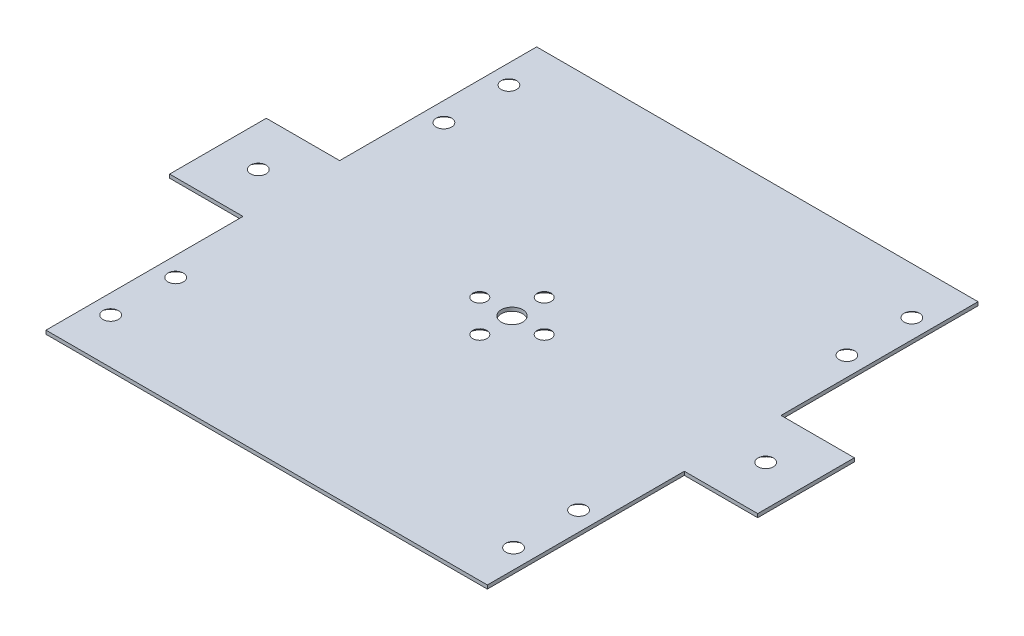
ISO-10303-21;
HEADER;
FILE_DESCRIPTION(('STEP AP214'),'2;1');
FILE_NAME('part.step','',(''),(''),'','','');
FILE_SCHEMA(('AUTOMOTIVE_DESIGN { 1 0 10303 214 1 1 1 1 }'));
ENDSEC;
DATA;
#1=APPLICATION_CONTEXT('core data for automotive mechanical design processes');
#2=APPLICATION_PROTOCOL_DEFINITION('international standard','automotive_design',2000,#1);
#3=PRODUCT_CONTEXT('',#1,'mechanical');
#4=PRODUCT('Part','Part','',(#3));
#5=PRODUCT_RELATED_PRODUCT_CATEGORY('part','',(#4));
#6=PRODUCT_DEFINITION_FORMATION('','',#4);
#7=PRODUCT_DEFINITION_CONTEXT('part definition',#1,'design');
#8=PRODUCT_DEFINITION('design','',#6,#7);
#9=PRODUCT_DEFINITION_SHAPE('','',#8);
#10=(LENGTH_UNIT() NAMED_UNIT(*) SI_UNIT(.MILLI.,.METRE.));
#11=(NAMED_UNIT(*) PLANE_ANGLE_UNIT() SI_UNIT($,.RADIAN.));
#12=(NAMED_UNIT(*) SI_UNIT($,.STERADIAN.) SOLID_ANGLE_UNIT());
#13=UNCERTAINTY_MEASURE_WITH_UNIT(LENGTH_MEASURE(1.E-05),#10,'distance_accuracy_value','');
#14=(GEOMETRIC_REPRESENTATION_CONTEXT(3) GLOBAL_UNCERTAINTY_ASSIGNED_CONTEXT((#13)) GLOBAL_UNIT_ASSIGNED_CONTEXT((#10,
#11,#12)) REPRESENTATION_CONTEXT('',''));
#15=CARTESIAN_POINT('',(0.,0.,0.));
#16=DIRECTION('',(0.,0.,1.));
#17=DIRECTION('',(1.,0.,0.));
#18=AXIS2_PLACEMENT_3D('',#15,#16,#17);
#19=CARTESIAN_POINT('',(0.,1.0668,0.));
#20=DIRECTION('',(0.,-1.,0.));
#21=DIRECTION('',(0.,0.,-1.));
#22=AXIS2_PLACEMENT_3D('',#19,#20,#21);
#23=PLANE('',#22);
#24=CARTESIAN_POINT('',(9.50000000000003,1.0668,0.));
#25=DIRECTION('',(0.,-1.,0.));
#26=DIRECTION('',(0.,0.,-1.));
#27=AXIS2_PLACEMENT_3D('',#24,#25,#26);
#28=CIRCLE('',#27,2.0832);
#29=CARTESIAN_POINT('',(9.50000000000003,1.0668,-2.0832));
#30=VERTEX_POINT('',#29);
#31=EDGE_CURVE('E334',#30,#30,#28,.T.);
#32=ORIENTED_EDGE('',*,*,#31,.T.);
#33=EDGE_LOOP('',(#32));
#34=FACE_BOUND('',#33,.T.);
#35=CARTESIAN_POINT('',(0.,1.0668,-9.5));
#36=DIRECTION('',(0.,-1.,0.));
#37=DIRECTION('',(0.,0.,-1.));
#38=AXIS2_PLACEMENT_3D('',#35,#36,#37);
#39=CIRCLE('',#38,2.0832);
#40=CARTESIAN_POINT('',(0.,1.0668,-11.5832));
#41=VERTEX_POINT('',#40);
#42=EDGE_CURVE('E347',#41,#41,#39,.T.);
#43=ORIENTED_EDGE('',*,*,#42,.T.);
#44=EDGE_LOOP('',(#43));
#45=FACE_BOUND('',#44,.T.);
#46=CARTESIAN_POINT('',(0.,1.0668,0.));
#47=DIRECTION('',(0.,-1.,0.));
#48=DIRECTION('',(0.,0.,-1.));
#49=AXIS2_PLACEMENT_3D('',#46,#47,#48);
#50=CIRCLE('',#49,3.175);
#51=CARTESIAN_POINT('',(0.,1.0668,-3.175));
#52=VERTEX_POINT('',#51);
#53=EDGE_CURVE('E357',#52,#52,#50,.T.);
#54=ORIENTED_EDGE('',*,*,#53,.T.);
#55=EDGE_LOOP('',(#54));
#56=FACE_BOUND('',#55,.T.);
#57=CARTESIAN_POINT('',(-59.420125,1.0668,58.959758400001));
#58=DIRECTION('',(0.,-1.,0.));
#59=DIRECTION('',(0.,0.,-1.));
#60=AXIS2_PLACEMENT_3D('',#57,#58,#59);
#61=CIRCLE('',#60,2.27193726742048);
#62=CARTESIAN_POINT('',(-59.420125,1.0668,56.6878211325805));
#63=VERTEX_POINT('',#62);
#64=EDGE_CURVE('E365',#63,#63,#61,.T.);
#65=ORIENTED_EDGE('',*,*,#64,.T.);
#66=EDGE_LOOP('',(#65));
#67=FACE_BOUND('',#66,.T.);
#68=CARTESIAN_POINT('',(59.420125,1.0668,-58.5152499999991));
#69=DIRECTION('',(0.,-1.,0.));
#70=DIRECTION('',(0.,0.,-1.));
#71=AXIS2_PLACEMENT_3D('',#68,#69,#70);
#72=CIRCLE('',#71,2.27193726742048);
#73=CARTESIAN_POINT('',(59.420125,1.0668,-60.7871872674196));
#74=VERTEX_POINT('',#73);
#75=EDGE_CURVE('E377',#74,#74,#72,.T.);
#76=ORIENTED_EDGE('',*,*,#75,.T.);
#77=EDGE_LOOP('',(#76));
#78=FACE_BOUND('',#77,.T.);
#79=CARTESIAN_POINT('',(59.420125,1.0668,39.7827500000009));
#80=DIRECTION('',(0.,-1.,0.));
#81=DIRECTION('',(0.,0.,-1.));
#82=AXIS2_PLACEMENT_3D('',#79,#80,#81);
#83=CIRCLE('',#82,2.27193726742048);
#84=CARTESIAN_POINT('',(59.420125,1.0668,37.5108127325805));
#85=VERTEX_POINT('',#84);
#86=EDGE_CURVE('E389',#85,#85,#83,.T.);
#87=ORIENTED_EDGE('',*,*,#86,.T.);
#88=EDGE_LOOP('',(#87));
#89=FACE_BOUND('',#88,.T.);
#90=CARTESIAN_POINT('',(59.420125,1.0668,-39.3382499999991));
#91=DIRECTION('',(0.,-1.,0.));
#92=DIRECTION('',(0.,0.,-1.));
#93=AXIS2_PLACEMENT_3D('',#90,#91,#92);
#94=CIRCLE('',#93,2.27193726742048);
#95=CARTESIAN_POINT('',(59.420125,1.0668,-41.6101872674196));
#96=VERTEX_POINT('',#95);
#97=EDGE_CURVE('E401',#96,#96,#94,.T.);
#98=ORIENTED_EDGE('',*,*,#97,.T.);
#99=EDGE_LOOP('',(#98));
#100=FACE_BOUND('',#99,.T.);
#101=CARTESIAN_POINT('',(-74.818875,1.0668,0.));
#102=DIRECTION('',(0.,-1.,0.));
#103=DIRECTION('',(0.,0.,-1.));
#104=AXIS2_PLACEMENT_3D('',#101,#102,#103);
#105=CIRCLE('',#104,2.27193726742048);
#106=CARTESIAN_POINT('',(-74.818875,1.0668,-2.27193726742048));
#107=VERTEX_POINT('',#106);
#108=EDGE_CURVE('E413',#107,#107,#105,.T.);
#109=ORIENTED_EDGE('',*,*,#108,.T.);
#110=EDGE_LOOP('',(#109));
#111=FACE_BOUND('',#110,.T.);
#112=DIRECTION('',(0.,0.,1.));
#113=VECTOR('',#112,1.);
#114=CARTESIAN_POINT('',(-65.0875,1.0668,72.35825));
#115=LINE('',#114,#113);
#116=CARTESIAN_POINT('',(-65.0875,1.0668,14.25575));
#117=VERTEX_POINT('',#116);
#118=CARTESIAN_POINT('',(-65.0875,1.0668,72.35825));
#119=VERTEX_POINT('',#118);
#120=EDGE_CURVE('E181',#117,#119,#115,.T.);
#121=ORIENTED_EDGE('',*,*,#120,.T.);
#122=DIRECTION('',(1.,0.,0.));
#123=VECTOR('',#122,1.);
#124=CARTESIAN_POINT('',(-65.0875,1.0668,72.35825));
#125=LINE('',#124,#123);
#126=CARTESIAN_POINT('',(65.0875,1.0668,72.35825));
#127=VERTEX_POINT('',#126);
#128=EDGE_CURVE('E109',#119,#127,#125,.T.);
#129=ORIENTED_EDGE('',*,*,#128,.T.);
#130=DIRECTION('',(0.,0.,-1.));
#131=VECTOR('',#130,1.);
#132=CARTESIAN_POINT('',(65.0875,1.0668,72.35825));
#133=LINE('',#132,#131);
#134=CARTESIAN_POINT('',(65.0875,1.0668,14.25575));
#135=VERTEX_POINT('',#134);
#136=EDGE_CURVE('E208',#127,#135,#133,.T.);
#137=ORIENTED_EDGE('',*,*,#136,.T.);
#138=DIRECTION('',(1.,0.,0.));
#139=VECTOR('',#138,1.);
#140=CARTESIAN_POINT('',(86.725125,1.0668,14.25575));
#141=LINE('',#140,#139);
#142=CARTESIAN_POINT('',(86.725125,1.0668,14.25575));
#143=VERTEX_POINT('',#142);
#144=EDGE_CURVE('E226',#135,#143,#141,.T.);
#145=ORIENTED_EDGE('',*,*,#144,.T.);
#146=DIRECTION('',(0.,0.,-1.));
#147=VECTOR('',#146,1.);
#148=CARTESIAN_POINT('',(86.725125,1.0668,-14.25575));
#149=LINE('',#148,#147);
#150=CARTESIAN_POINT('',(86.725125,1.0668,-14.25575));
#151=VERTEX_POINT('',#150);
#152=EDGE_CURVE('E223',#143,#151,#149,.T.);
#153=ORIENTED_EDGE('',*,*,#152,.T.);
#154=DIRECTION('',(-1.,0.,0.));
#155=VECTOR('',#154,1.);
#156=CARTESIAN_POINT('',(86.725125,1.0668,-14.25575));
#157=LINE('',#156,#155);
#158=CARTESIAN_POINT('',(65.0875,1.0668,-14.25575));
#159=VERTEX_POINT('',#158);
#160=EDGE_CURVE('E225',#151,#159,#157,.T.);
#161=ORIENTED_EDGE('',*,*,#160,.T.);
#162=DIRECTION('',(0.,0.,-1.));
#163=VECTOR('',#162,1.);
#164=CARTESIAN_POINT('',(65.0875,1.0668,-72.35825));
#165=LINE('',#164,#163);
#166=CARTESIAN_POINT('',(65.0875,1.0668,-72.35825));
#167=VERTEX_POINT('',#166);
#168=EDGE_CURVE('E228',#159,#167,#165,.T.);
#169=ORIENTED_EDGE('',*,*,#168,.T.);
#170=DIRECTION('',(-1.,0.,0.));
#171=VECTOR('',#170,1.);
#172=CARTESIAN_POINT('',(-65.0875,1.0668,-72.35825));
#173=LINE('',#172,#171);
#174=CARTESIAN_POINT('',(-65.0875,1.0668,-72.35825));
#175=VERTEX_POINT('',#174);
#176=EDGE_CURVE('E234',#167,#175,#173,.T.);
#177=ORIENTED_EDGE('',*,*,#176,.T.);
#178=DIRECTION('',(0.,0.,1.));
#179=VECTOR('',#178,1.);
#180=CARTESIAN_POINT('',(-65.0875,1.0668,-72.35825));
#181=LINE('',#180,#179);
#182=CARTESIAN_POINT('',(-65.0875,1.0668,-14.25575));
#183=VERTEX_POINT('',#182);
#184=EDGE_CURVE('E140',#175,#183,#181,.T.);
#185=ORIENTED_EDGE('',*,*,#184,.T.);
#186=DIRECTION('',(-1.,0.,0.));
#187=VECTOR('',#186,1.);
#188=CARTESIAN_POINT('',(-86.725125,1.0668,-14.25575));
#189=LINE('',#188,#187);
#190=CARTESIAN_POINT('',(-86.725125,1.0668,-14.25575));
#191=VERTEX_POINT('',#190);
#192=EDGE_CURVE('E134',#183,#191,#189,.T.);
#193=ORIENTED_EDGE('',*,*,#192,.T.);
#194=DIRECTION('',(0.,0.,1.));
#195=VECTOR('',#194,1.);
#196=CARTESIAN_POINT('',(-86.725125,1.0668,-14.25575));
#197=LINE('',#196,#195);
#198=CARTESIAN_POINT('',(-86.725125,1.0668,14.25575));
#199=VERTEX_POINT('',#198);
#200=EDGE_CURVE('E138',#191,#199,#197,.T.);
#201=ORIENTED_EDGE('',*,*,#200,.T.);
#202=DIRECTION('',(1.,0.,0.));
#203=VECTOR('',#202,1.);
#204=CARTESIAN_POINT('',(-86.725125,1.0668,14.25575));
#205=LINE('',#204,#203);
#206=EDGE_CURVE('E54',#199,#117,#205,.T.);
#207=ORIENTED_EDGE('',*,*,#206,.T.);
#208=EDGE_LOOP('',(#121,#129,#137,#145,#153,#161,#169,#177,#185,#193,#201,#207));
#209=FACE_BOUND('',#208,.T.);
#210=CARTESIAN_POINT('',(74.818875,1.0668,0.));
#211=DIRECTION('',(0.,-1.,0.));
#212=DIRECTION('',(0.,0.,-1.));
#213=AXIS2_PLACEMENT_3D('',#210,#211,#212);
#214=CIRCLE('',#213,2.27193726742048);
#215=CARTESIAN_POINT('',(74.818875,1.0668,-2.27193726742048));
#216=VERTEX_POINT('',#215);
#217=EDGE_CURVE('E162',#216,#216,#214,.T.);
#218=ORIENTED_EDGE('',*,*,#217,.T.);
#219=EDGE_LOOP('',(#218));
#220=FACE_BOUND('',#219,.T.);
#221=CARTESIAN_POINT('',(-59.420125,1.0668,39.7827584000009));
#222=DIRECTION('',(0.,-1.,0.));
#223=DIRECTION('',(0.,0.,-1.));
#224=AXIS2_PLACEMENT_3D('',#221,#222,#223);
#225=CIRCLE('',#224,2.27193726742048);
#226=CARTESIAN_POINT('',(-59.420125,1.0668,37.5108211325805));
#227=VERTEX_POINT('',#226);
#228=EDGE_CURVE('E407',#227,#227,#225,.T.);
#229=ORIENTED_EDGE('',*,*,#228,.T.);
#230=EDGE_LOOP('',(#229));
#231=FACE_BOUND('',#230,.T.);
#232=CARTESIAN_POINT('',(-59.420125,1.0668,-39.3382415999991));
#233=DIRECTION('',(0.,-1.,0.));
#234=DIRECTION('',(0.,0.,-1.));
#235=AXIS2_PLACEMENT_3D('',#232,#233,#234);
#236=CIRCLE('',#235,2.27193726742048);
#237=CARTESIAN_POINT('',(-59.420125,1.0668,-41.6101788674196));
#238=VERTEX_POINT('',#237);
#239=EDGE_CURVE('E395',#238,#238,#236,.T.);
#240=ORIENTED_EDGE('',*,*,#239,.T.);
#241=EDGE_LOOP('',(#240));
#242=FACE_BOUND('',#241,.T.);
#243=CARTESIAN_POINT('',(59.420125,1.0668,58.959750000001));
#244=DIRECTION('',(0.,-1.,0.));
#245=DIRECTION('',(0.,0.,-1.));
#246=AXIS2_PLACEMENT_3D('',#243,#244,#245);
#247=CIRCLE('',#246,2.27193726742048);
#248=CARTESIAN_POINT('',(59.420125,1.0668,56.6878127325805));
#249=VERTEX_POINT('',#248);
#250=EDGE_CURVE('E383',#249,#249,#247,.T.);
#251=ORIENTED_EDGE('',*,*,#250,.T.);
#252=EDGE_LOOP('',(#251));
#253=FACE_BOUND('',#252,.T.);
#254=CARTESIAN_POINT('',(-59.420125,1.0668,-58.5152415999991));
#255=DIRECTION('',(0.,-1.,0.));
#256=DIRECTION('',(0.,0.,-1.));
#257=AXIS2_PLACEMENT_3D('',#254,#255,#256);
#258=CIRCLE('',#257,2.27193726742048);
#259=CARTESIAN_POINT('',(-59.420125,1.0668,-60.7871788674196));
#260=VERTEX_POINT('',#259);
#261=EDGE_CURVE('E371',#260,#260,#258,.T.);
#262=ORIENTED_EDGE('',*,*,#261,.T.);
#263=EDGE_LOOP('',(#262));
#264=FACE_BOUND('',#263,.T.);
#265=CARTESIAN_POINT('',(0.,1.0668,9.5));
#266=DIRECTION('',(0.,-1.,0.));
#267=DIRECTION('',(0.,0.,-1.));
#268=AXIS2_PLACEMENT_3D('',#265,#266,#267);
#269=CIRCLE('',#268,2.0832);
#270=CARTESIAN_POINT('',(0.,1.0668,7.4168));
#271=VERTEX_POINT('',#270);
#272=EDGE_CURVE('E353',#271,#271,#269,.T.);
#273=ORIENTED_EDGE('',*,*,#272,.T.);
#274=EDGE_LOOP('',(#273));
#275=FACE_BOUND('',#274,.T.);
#276=CARTESIAN_POINT('',(-9.50000000000003,1.0668,0.));
#277=DIRECTION('',(0.,-1.,0.));
#278=DIRECTION('',(0.,0.,-1.));
#279=AXIS2_PLACEMENT_3D('',#276,#277,#278);
#280=CIRCLE('',#279,2.0832);
#281=CARTESIAN_POINT('',(-9.50000000000003,1.0668,-2.0832));
#282=VERTEX_POINT('',#281);
#283=EDGE_CURVE('E338',#282,#282,#280,.T.);
#284=ORIENTED_EDGE('',*,*,#283,.T.);
#285=EDGE_LOOP('',(#284));
#286=FACE_BOUND('',#285,.T.);
#287=ADVANCED_FACE('F37',(#34,#45,#56,#67,#78,#89,#100,#111,#209,#220,#231,#242,#253,#264,#275,
#286),#23,.F.);
#288=CARTESIAN_POINT('',(-65.0875,1.0668,72.35825));
#289=DIRECTION('',(1.,0.,0.));
#290=DIRECTION('',(0.,0.,-1.));
#291=AXIS2_PLACEMENT_3D('',#288,#289,#290);
#292=PLANE('',#291);
#293=DIRECTION('',(0.,0.,1.));
#294=VECTOR('',#293,1.);
#295=CARTESIAN_POINT('',(-65.0875,0.,72.35825));
#296=LINE('',#295,#294);
#297=CARTESIAN_POINT('',(-65.0875,0.,14.25575));
#298=VERTEX_POINT('',#297);
#299=CARTESIAN_POINT('',(-65.0875,0.,72.35825));
#300=VERTEX_POINT('',#299);
#301=EDGE_CURVE('E158',#298,#300,#296,.T.);
#302=ORIENTED_EDGE('',*,*,#301,.T.);
#303=DIRECTION('',(0.,-1.,0.));
#304=VECTOR('',#303,1.);
#305=CARTESIAN_POINT('',(-65.0875,1.0668,72.35825));
#306=LINE('',#305,#304);
#307=EDGE_CURVE('E11',#119,#300,#306,.T.);
#308=ORIENTED_EDGE('',*,*,#307,.F.);
#309=ORIENTED_EDGE('',*,*,#120,.F.);
#310=DIRECTION('',(0.,-1.,0.));
#311=VECTOR('',#310,1.);
#312=CARTESIAN_POINT('',(-65.0875,1.0668,14.25575));
#313=LINE('',#312,#311);
#314=EDGE_CURVE('E154',#117,#298,#313,.T.);
#315=ORIENTED_EDGE('',*,*,#314,.T.);
#316=EDGE_LOOP('',(#302,#308,#309,#315));
#317=FACE_BOUND('',#316,.T.);
#318=ADVANCED_FACE('F39',(#317),#292,.F.);
#319=CARTESIAN_POINT('',(-65.0875,1.0668,72.35825));
#320=DIRECTION('',(0.,0.,-1.));
#321=DIRECTION('',(-1.,0.,0.));
#322=AXIS2_PLACEMENT_3D('',#319,#320,#321);
#323=PLANE('',#322);
#324=DIRECTION('',(1.,0.,0.));
#325=VECTOR('',#324,1.);
#326=CARTESIAN_POINT('',(-65.0875,0.,72.35825));
#327=LINE('',#326,#325);
#328=CARTESIAN_POINT('',(65.0875,0.,72.35825));
#329=VERTEX_POINT('',#328);
#330=EDGE_CURVE('E161',#300,#329,#327,.T.);
#331=ORIENTED_EDGE('',*,*,#330,.T.);
#332=DIRECTION('',(0.,-1.,0.));
#333=VECTOR('',#332,1.);
#334=CARTESIAN_POINT('',(65.0875,1.0668,72.35825));
#335=LINE('',#334,#333);
#336=EDGE_CURVE('E46',#127,#329,#335,.T.);
#337=ORIENTED_EDGE('',*,*,#336,.F.);
#338=ORIENTED_EDGE('',*,*,#128,.F.);
#339=ORIENTED_EDGE('',*,*,#307,.T.);
#340=EDGE_LOOP('',(#331,#337,#338,#339));
#341=FACE_BOUND('',#340,.T.);
#342=ADVANCED_FACE('F265',(#341),#323,.F.);
#343=CARTESIAN_POINT('',(65.0875,1.0668,72.35825));
#344=DIRECTION('',(-1.,0.,0.));
#345=DIRECTION('',(0.,0.,1.));
#346=AXIS2_PLACEMENT_3D('',#343,#344,#345);
#347=PLANE('',#346);
#348=DIRECTION('',(0.,0.,-1.));
#349=VECTOR('',#348,1.);
#350=CARTESIAN_POINT('',(65.0875,0.,72.35825));
#351=LINE('',#350,#349);
#352=CARTESIAN_POINT('',(65.0875,0.,14.25575));
#353=VERTEX_POINT('',#352);
#354=EDGE_CURVE('E164',#329,#353,#351,.T.);
#355=ORIENTED_EDGE('',*,*,#354,.T.);
#356=DIRECTION('',(0.,-1.,0.));
#357=VECTOR('',#356,1.);
#358=CARTESIAN_POINT('',(65.0875,1.0668,14.25575));
#359=LINE('',#358,#357);
#360=EDGE_CURVE('E200',#135,#353,#359,.T.);
#361=ORIENTED_EDGE('',*,*,#360,.F.);
#362=ORIENTED_EDGE('',*,*,#136,.F.);
#363=ORIENTED_EDGE('',*,*,#336,.T.);
#364=EDGE_LOOP('',(#355,#361,#362,#363));
#365=FACE_BOUND('',#364,.T.);
#366=ADVANCED_FACE('F206',(#365),#347,.F.);
#367=CARTESIAN_POINT('',(86.725125,1.0668,14.25575));
#368=DIRECTION('',(0.,0.,-1.));
#369=DIRECTION('',(-1.,0.,0.));
#370=AXIS2_PLACEMENT_3D('',#367,#368,#369);
#371=PLANE('',#370);
#372=DIRECTION('',(1.,0.,0.));
#373=VECTOR('',#372,1.);
#374=CARTESIAN_POINT('',(86.725125,0.,14.25575));
#375=LINE('',#374,#373);
#376=CARTESIAN_POINT('',(86.725125,0.,14.25575));
#377=VERTEX_POINT('',#376);
#378=EDGE_CURVE('E166',#353,#377,#375,.T.);
#379=ORIENTED_EDGE('',*,*,#378,.T.);
#380=DIRECTION('',(0.,-1.,0.));
#381=VECTOR('',#380,1.);
#382=CARTESIAN_POINT('',(86.725125,1.0668,14.25575));
#383=LINE('',#382,#381);
#384=EDGE_CURVE('E197',#143,#377,#383,.T.);
#385=ORIENTED_EDGE('',*,*,#384,.F.);
#386=ORIENTED_EDGE('',*,*,#144,.F.);
#387=ORIENTED_EDGE('',*,*,#360,.T.);
#388=EDGE_LOOP('',(#379,#385,#386,#387));
#389=FACE_BOUND('',#388,.T.);
#390=ADVANCED_FACE('F217',(#389),#371,.F.);
#391=CARTESIAN_POINT('',(86.725125,1.0668,-14.25575));
#392=DIRECTION('',(-1.,0.,0.));
#393=DIRECTION('',(0.,0.,1.));
#394=AXIS2_PLACEMENT_3D('',#391,#392,#393);
#395=PLANE('',#394);
#396=DIRECTION('',(0.,0.,-1.));
#397=VECTOR('',#396,1.);
#398=CARTESIAN_POINT('',(86.725125,0.,-14.25575));
#399=LINE('',#398,#397);
#400=CARTESIAN_POINT('',(86.725125,0.,-14.25575));
#401=VERTEX_POINT('',#400);
#402=EDGE_CURVE('E168',#377,#401,#399,.T.);
#403=ORIENTED_EDGE('',*,*,#402,.T.);
#404=DIRECTION('',(0.,-1.,0.));
#405=VECTOR('',#404,1.);
#406=CARTESIAN_POINT('',(86.725125,1.0668,-14.25575));
#407=LINE('',#406,#405);
#408=EDGE_CURVE('E194',#151,#401,#407,.T.);
#409=ORIENTED_EDGE('',*,*,#408,.F.);
#410=ORIENTED_EDGE('',*,*,#152,.F.);
#411=ORIENTED_EDGE('',*,*,#384,.T.);
#412=EDGE_LOOP('',(#403,#409,#410,#411));
#413=FACE_BOUND('',#412,.T.);
#414=ADVANCED_FACE('F221',(#413),#395,.F.);
#415=CARTESIAN_POINT('',(86.725125,1.0668,-14.25575));
#416=DIRECTION('',(0.,0.,1.));
#417=DIRECTION('',(1.,0.,0.));
#418=AXIS2_PLACEMENT_3D('',#415,#416,#417);
#419=PLANE('',#418);
#420=DIRECTION('',(-1.,0.,0.));
#421=VECTOR('',#420,1.);
#422=CARTESIAN_POINT('',(86.725125,0.,-14.25575));
#423=LINE('',#422,#421);
#424=CARTESIAN_POINT('',(65.0875,0.,-14.25575));
#425=VERTEX_POINT('',#424);
#426=EDGE_CURVE('E170',#401,#425,#423,.T.);
#427=ORIENTED_EDGE('',*,*,#426,.T.);
#428=DIRECTION('',(0.,-1.,0.));
#429=VECTOR('',#428,1.);
#430=CARTESIAN_POINT('',(65.0875,1.0668,-14.25575));
#431=LINE('',#430,#429);
#432=EDGE_CURVE('E191',#159,#425,#431,.T.);
#433=ORIENTED_EDGE('',*,*,#432,.F.);
#434=ORIENTED_EDGE('',*,*,#160,.F.);
#435=ORIENTED_EDGE('',*,*,#408,.T.);
#436=EDGE_LOOP('',(#427,#433,#434,#435));
#437=FACE_BOUND('',#436,.T.);
#438=ADVANCED_FACE('F625',(#437),#419,.F.);
#439=CARTESIAN_POINT('',(65.0875,1.0668,-72.35825));
#440=DIRECTION('',(-1.,0.,0.));
#441=DIRECTION('',(0.,0.,1.));
#442=AXIS2_PLACEMENT_3D('',#439,#440,#441);
#443=PLANE('',#442);
#444=DIRECTION('',(0.,0.,-1.));
#445=VECTOR('',#444,1.);
#446=CARTESIAN_POINT('',(65.0875,0.,-72.35825));
#447=LINE('',#446,#445);
#448=CARTESIAN_POINT('',(65.0875,0.,-72.35825));
#449=VERTEX_POINT('',#448);
#450=EDGE_CURVE('E172',#425,#449,#447,.T.);
#451=ORIENTED_EDGE('',*,*,#450,.T.);
#452=DIRECTION('',(0.,-1.,0.));
#453=VECTOR('',#452,1.);
#454=CARTESIAN_POINT('',(65.0875,1.0668,-72.35825));
#455=LINE('',#454,#453);
#456=EDGE_CURVE('E188',#167,#449,#455,.T.);
#457=ORIENTED_EDGE('',*,*,#456,.F.);
#458=ORIENTED_EDGE('',*,*,#168,.F.);
#459=ORIENTED_EDGE('',*,*,#432,.T.);
#460=EDGE_LOOP('',(#451,#457,#458,#459));
#461=FACE_BOUND('',#460,.T.);
#462=ADVANCED_FACE('F617',(#461),#443,.F.);
#463=CARTESIAN_POINT('',(-65.0875,1.0668,-72.35825));
#464=DIRECTION('',(0.,0.,1.));
#465=DIRECTION('',(1.,0.,0.));
#466=AXIS2_PLACEMENT_3D('',#463,#464,#465);
#467=PLANE('',#466);
#468=DIRECTION('',(-1.,0.,0.));
#469=VECTOR('',#468,1.);
#470=CARTESIAN_POINT('',(-65.0875,0.,-72.35825));
#471=LINE('',#470,#469);
#472=CARTESIAN_POINT('',(-65.0875,0.,-72.35825));
#473=VERTEX_POINT('',#472);
#474=EDGE_CURVE('E174',#449,#473,#471,.T.);
#475=ORIENTED_EDGE('',*,*,#474,.T.);
#476=DIRECTION('',(0.,-1.,0.));
#477=VECTOR('',#476,1.);
#478=CARTESIAN_POINT('',(-65.0875,1.0668,-72.35825));
#479=LINE('',#478,#477);
#480=EDGE_CURVE('E185',#175,#473,#479,.T.);
#481=ORIENTED_EDGE('',*,*,#480,.F.);
#482=ORIENTED_EDGE('',*,*,#176,.F.);
#483=ORIENTED_EDGE('',*,*,#456,.T.);
#484=EDGE_LOOP('',(#475,#481,#482,#483));
#485=FACE_BOUND('',#484,.T.);
#486=ADVANCED_FACE('F240',(#485),#467,.F.);
#487=CARTESIAN_POINT('',(-65.0875,1.0668,-72.35825));
#488=DIRECTION('',(1.,0.,0.));
#489=DIRECTION('',(0.,0.,-1.));
#490=AXIS2_PLACEMENT_3D('',#487,#488,#489);
#491=PLANE('',#490);
#492=DIRECTION('',(0.,0.,1.));
#493=VECTOR('',#492,1.);
#494=CARTESIAN_POINT('',(-65.0875,0.,-72.35825));
#495=LINE('',#494,#493);
#496=CARTESIAN_POINT('',(-65.0875,0.,-14.25575));
#497=VERTEX_POINT('',#496);
#498=EDGE_CURVE('E176',#473,#497,#495,.T.);
#499=ORIENTED_EDGE('',*,*,#498,.T.);
#500=DIRECTION('',(0.,-1.,0.));
#501=VECTOR('',#500,1.);
#502=CARTESIAN_POINT('',(-65.0875,1.0668,-14.25575));
#503=LINE('',#502,#501);
#504=EDGE_CURVE('E149',#183,#497,#503,.T.);
#505=ORIENTED_EDGE('',*,*,#504,.F.);
#506=ORIENTED_EDGE('',*,*,#184,.F.);
#507=ORIENTED_EDGE('',*,*,#480,.T.);
#508=EDGE_LOOP('',(#499,#505,#506,#507));
#509=FACE_BOUND('',#508,.T.);
#510=ADVANCED_FACE('F244',(#509),#491,.F.);
#511=CARTESIAN_POINT('',(-86.725125,1.0668,-14.25575));
#512=DIRECTION('',(0.,0.,1.));
#513=DIRECTION('',(1.,0.,0.));
#514=AXIS2_PLACEMENT_3D('',#511,#512,#513);
#515=PLANE('',#514);
#516=DIRECTION('',(-1.,0.,0.));
#517=VECTOR('',#516,1.);
#518=CARTESIAN_POINT('',(-86.725125,0.,-14.25575));
#519=LINE('',#518,#517);
#520=CARTESIAN_POINT('',(-86.725125,0.,-14.25575));
#521=VERTEX_POINT('',#520);
#522=EDGE_CURVE('E148',#497,#521,#519,.T.);
#523=ORIENTED_EDGE('',*,*,#522,.T.);
#524=DIRECTION('',(0.,-1.,0.));
#525=VECTOR('',#524,1.);
#526=CARTESIAN_POINT('',(-86.725125,1.0668,-14.25575));
#527=LINE('',#526,#525);
#528=EDGE_CURVE('E145',#191,#521,#527,.T.);
#529=ORIENTED_EDGE('',*,*,#528,.F.);
#530=ORIENTED_EDGE('',*,*,#192,.F.);
#531=ORIENTED_EDGE('',*,*,#504,.T.);
#532=EDGE_LOOP('',(#523,#529,#530,#531));
#533=FACE_BOUND('',#532,.T.);
#534=ADVANCED_FACE('F146',(#533),#515,.F.);
#535=CARTESIAN_POINT('',(-86.725125,1.0668,-14.25575));
#536=DIRECTION('',(1.,0.,0.));
#537=DIRECTION('',(0.,0.,-1.));
#538=AXIS2_PLACEMENT_3D('',#535,#536,#537);
#539=PLANE('',#538);
#540=DIRECTION('',(0.,0.,1.));
#541=VECTOR('',#540,1.);
#542=CARTESIAN_POINT('',(-86.725125,0.,-14.25575));
#543=LINE('',#542,#541);
#544=CARTESIAN_POINT('',(-86.725125,0.,14.25575));
#545=VERTEX_POINT('',#544);
#546=EDGE_CURVE('E95',#521,#545,#543,.T.);
#547=ORIENTED_EDGE('',*,*,#546,.T.);
#548=DIRECTION('',(0.,-1.,0.));
#549=VECTOR('',#548,1.);
#550=CARTESIAN_POINT('',(-86.725125,1.0668,14.25575));
#551=LINE('',#550,#549);
#552=EDGE_CURVE('E150',#199,#545,#551,.T.);
#553=ORIENTED_EDGE('',*,*,#552,.F.);
#554=ORIENTED_EDGE('',*,*,#200,.F.);
#555=ORIENTED_EDGE('',*,*,#528,.T.);
#556=EDGE_LOOP('',(#547,#553,#554,#555));
#557=FACE_BOUND('',#556,.T.);
#558=ADVANCED_FACE('F152',(#557),#539,.F.);
#559=CARTESIAN_POINT('',(-86.725125,1.0668,14.25575));
#560=DIRECTION('',(0.,0.,-1.));
#561=DIRECTION('',(-1.,0.,0.));
#562=AXIS2_PLACEMENT_3D('',#559,#560,#561);
#563=PLANE('',#562);
#564=DIRECTION('',(1.,0.,0.));
#565=VECTOR('',#564,1.);
#566=CARTESIAN_POINT('',(-86.725125,0.,14.25575));
#567=LINE('',#566,#565);
#568=EDGE_CURVE('E101',#545,#298,#567,.T.);
#569=ORIENTED_EDGE('',*,*,#568,.T.);
#570=ORIENTED_EDGE('',*,*,#314,.F.);
#571=ORIENTED_EDGE('',*,*,#206,.F.);
#572=ORIENTED_EDGE('',*,*,#552,.T.);
#573=EDGE_LOOP('',(#569,#570,#571,#572));
#574=FACE_BOUND('',#573,.T.);
#575=ADVANCED_FACE('F248',(#574),#563,.F.);
#576=CARTESIAN_POINT('',(0.,0.,0.));
#577=DIRECTION('',(0.,-1.,0.));
#578=DIRECTION('',(0.,0.,-1.));
#579=AXIS2_PLACEMENT_3D('',#576,#577,#578);
#580=PLANE('',#579);
#581=CARTESIAN_POINT('',(9.50000000000003,0.,0.));
#582=DIRECTION('',(0.,-1.,0.));
#583=DIRECTION('',(0.,0.,-1.));
#584=AXIS2_PLACEMENT_3D('',#581,#582,#583);
#585=CIRCLE('',#584,3.15);
#586=CARTESIAN_POINT('',(9.50000000000003,0.,-3.15));
#587=VERTEX_POINT('',#586);
#588=EDGE_CURVE('E332',#587,#587,#585,.T.);
#589=ORIENTED_EDGE('',*,*,#588,.F.);
#590=EDGE_LOOP('',(#589));
#591=FACE_BOUND('',#590,.T.);
#592=CARTESIAN_POINT('',(-9.50000000000003,0.,0.));
#593=DIRECTION('',(0.,-1.,0.));
#594=DIRECTION('',(0.,0.,-1.));
#595=AXIS2_PLACEMENT_3D('',#592,#593,#594);
#596=CIRCLE('',#595,3.15);
#597=CARTESIAN_POINT('',(-9.50000000000003,0.,-3.15));
#598=VERTEX_POINT('',#597);
#599=EDGE_CURVE('E335',#598,#598,#596,.T.);
#600=ORIENTED_EDGE('',*,*,#599,.F.);
#601=EDGE_LOOP('',(#600));
#602=FACE_BOUND('',#601,.T.);
#603=CARTESIAN_POINT('',(0.,0.,-9.5));
#604=DIRECTION('',(0.,-1.,0.));
#605=DIRECTION('',(0.,0.,-1.));
#606=AXIS2_PLACEMENT_3D('',#603,#604,#605);
#607=CIRCLE('',#606,3.15);
#608=CARTESIAN_POINT('',(0.,0.,-12.65));
#609=VERTEX_POINT('',#608);
#610=EDGE_CURVE('E344',#609,#609,#607,.T.);
#611=ORIENTED_EDGE('',*,*,#610,.F.);
#612=EDGE_LOOP('',(#611));
#613=FACE_BOUND('',#612,.T.);
#614=CARTESIAN_POINT('',(0.,0.,9.5));
#615=DIRECTION('',(0.,-1.,0.));
#616=DIRECTION('',(0.,0.,-1.));
#617=AXIS2_PLACEMENT_3D('',#614,#615,#616);
#618=CIRCLE('',#617,3.15);
#619=CARTESIAN_POINT('',(0.,0.,6.35));
#620=VERTEX_POINT('',#619);
#621=EDGE_CURVE('E350',#620,#620,#618,.T.);
#622=ORIENTED_EDGE('',*,*,#621,.F.);
#623=EDGE_LOOP('',(#622));
#624=FACE_BOUND('',#623,.T.);
#625=CARTESIAN_POINT('',(0.,0.,0.));
#626=DIRECTION('',(0.,-1.,0.));
#627=DIRECTION('',(0.,0.,-1.));
#628=AXIS2_PLACEMENT_3D('',#625,#626,#627);
#629=CIRCLE('',#628,3.175);
#630=CARTESIAN_POINT('',(0.,0.,-3.175));
#631=VERTEX_POINT('',#630);
#632=EDGE_CURVE('E356',#631,#631,#629,.T.);
#633=ORIENTED_EDGE('',*,*,#632,.F.);
#634=EDGE_LOOP('',(#633));
#635=FACE_BOUND('',#634,.T.);
#636=CARTESIAN_POINT('',(-59.420125,0.,58.959758400001));
#637=DIRECTION('',(0.,-1.,0.));
#638=DIRECTION('',(0.,0.,-1.));
#639=AXIS2_PLACEMENT_3D('',#636,#637,#638);
#640=CIRCLE('',#639,3.5433);
#641=CARTESIAN_POINT('',(-59.420125,0.,55.416458400001));
#642=VERTEX_POINT('',#641);
#643=EDGE_CURVE('E360',#642,#642,#640,.T.);
#644=ORIENTED_EDGE('',*,*,#643,.F.);
#645=EDGE_LOOP('',(#644));
#646=FACE_BOUND('',#645,.T.);
#647=CARTESIAN_POINT('',(-59.420125,0.,-58.5152415999991));
#648=DIRECTION('',(0.,-1.,0.));
#649=DIRECTION('',(0.,0.,-1.));
#650=AXIS2_PLACEMENT_3D('',#647,#648,#649);
#651=CIRCLE('',#650,3.5433);
#652=CARTESIAN_POINT('',(-59.420125,0.,-62.0585415999991));
#653=VERTEX_POINT('',#652);
#654=EDGE_CURVE('E368',#653,#653,#651,.T.);
#655=ORIENTED_EDGE('',*,*,#654,.F.);
#656=EDGE_LOOP('',(#655));
#657=FACE_BOUND('',#656,.T.);
#658=CARTESIAN_POINT('',(59.420125,0.,-58.5152499999991));
#659=DIRECTION('',(0.,-1.,0.));
#660=DIRECTION('',(0.,0.,-1.));
#661=AXIS2_PLACEMENT_3D('',#658,#659,#660);
#662=CIRCLE('',#661,3.5433);
#663=CARTESIAN_POINT('',(59.420125,0.,-62.0585499999991));
#664=VERTEX_POINT('',#663);
#665=EDGE_CURVE('E374',#664,#664,#662,.T.);
#666=ORIENTED_EDGE('',*,*,#665,.F.);
#667=EDGE_LOOP('',(#666));
#668=FACE_BOUND('',#667,.T.);
#669=CARTESIAN_POINT('',(59.420125,0.,58.959750000001));
#670=DIRECTION('',(0.,-1.,0.));
#671=DIRECTION('',(0.,0.,-1.));
#672=AXIS2_PLACEMENT_3D('',#669,#670,#671);
#673=CIRCLE('',#672,3.5433);
#674=CARTESIAN_POINT('',(59.420125,0.,55.416450000001));
#675=VERTEX_POINT('',#674);
#676=EDGE_CURVE('E380',#675,#675,#673,.T.);
#677=ORIENTED_EDGE('',*,*,#676,.F.);
#678=EDGE_LOOP('',(#677));
#679=FACE_BOUND('',#678,.T.);
#680=CARTESIAN_POINT('',(59.420125,0.,39.7827500000009));
#681=DIRECTION('',(0.,-1.,0.));
#682=DIRECTION('',(0.,0.,-1.));
#683=AXIS2_PLACEMENT_3D('',#680,#681,#682);
#684=CIRCLE('',#683,3.5433);
#685=CARTESIAN_POINT('',(59.420125,0.,36.2394500000009));
#686=VERTEX_POINT('',#685);
#687=EDGE_CURVE('E386',#686,#686,#684,.T.);
#688=ORIENTED_EDGE('',*,*,#687,.F.);
#689=EDGE_LOOP('',(#688));
#690=FACE_BOUND('',#689,.T.);
#691=CARTESIAN_POINT('',(-59.420125,0.,-39.3382415999991));
#692=DIRECTION('',(0.,-1.,0.));
#693=DIRECTION('',(0.,0.,-1.));
#694=AXIS2_PLACEMENT_3D('',#691,#692,#693);
#695=CIRCLE('',#694,3.5433);
#696=CARTESIAN_POINT('',(-59.420125,0.,-42.8815415999991));
#697=VERTEX_POINT('',#696);
#698=EDGE_CURVE('E392',#697,#697,#695,.T.);
#699=ORIENTED_EDGE('',*,*,#698,.F.);
#700=EDGE_LOOP('',(#699));
#701=FACE_BOUND('',#700,.T.);
#702=CARTESIAN_POINT('',(59.420125,0.,-39.3382499999991));
#703=DIRECTION('',(0.,-1.,0.));
#704=DIRECTION('',(0.,0.,-1.));
#705=AXIS2_PLACEMENT_3D('',#702,#703,#704);
#706=CIRCLE('',#705,3.5433);
#707=CARTESIAN_POINT('',(59.420125,0.,-42.8815499999991));
#708=VERTEX_POINT('',#707);
#709=EDGE_CURVE('E398',#708,#708,#706,.T.);
#710=ORIENTED_EDGE('',*,*,#709,.F.);
#711=EDGE_LOOP('',(#710));
#712=FACE_BOUND('',#711,.T.);
#713=CARTESIAN_POINT('',(-59.420125,0.,39.7827584000009));
#714=DIRECTION('',(0.,-1.,0.));
#715=DIRECTION('',(0.,0.,-1.));
#716=AXIS2_PLACEMENT_3D('',#713,#714,#715);
#717=CIRCLE('',#716,3.5433);
#718=CARTESIAN_POINT('',(-59.420125,0.,36.2394584000009));
#719=VERTEX_POINT('',#718);
#720=EDGE_CURVE('E404',#719,#719,#717,.T.);
#721=ORIENTED_EDGE('',*,*,#720,.F.);
#722=EDGE_LOOP('',(#721));
#723=FACE_BOUND('',#722,.T.);
#724=CARTESIAN_POINT('',(-74.818875,0.,0.));
#725=DIRECTION('',(0.,-1.,0.));
#726=DIRECTION('',(0.,0.,-1.));
#727=AXIS2_PLACEMENT_3D('',#724,#725,#726);
#728=CIRCLE('',#727,3.5433);
#729=CARTESIAN_POINT('',(-74.818875,0.,-3.5433));
#730=VERTEX_POINT('',#729);
#731=EDGE_CURVE('E410',#730,#730,#728,.T.);
#732=ORIENTED_EDGE('',*,*,#731,.F.);
#733=EDGE_LOOP('',(#732));
#734=FACE_BOUND('',#733,.T.);
#735=CARTESIAN_POINT('',(74.818875,0.,0.));
#736=DIRECTION('',(0.,-1.,0.));
#737=DIRECTION('',(0.,0.,-1.));
#738=AXIS2_PLACEMENT_3D('',#735,#736,#737);
#739=CIRCLE('',#738,3.5433);
#740=CARTESIAN_POINT('',(74.818875,0.,-3.5433));
#741=VERTEX_POINT('',#740);
#742=EDGE_CURVE('E416',#741,#741,#739,.T.);
#743=ORIENTED_EDGE('',*,*,#742,.F.);
#744=EDGE_LOOP('',(#743));
#745=FACE_BOUND('',#744,.T.);
#746=ORIENTED_EDGE('',*,*,#301,.F.);
#747=ORIENTED_EDGE('',*,*,#568,.F.);
#748=ORIENTED_EDGE('',*,*,#546,.F.);
#749=ORIENTED_EDGE('',*,*,#522,.F.);
#750=ORIENTED_EDGE('',*,*,#498,.F.);
#751=ORIENTED_EDGE('',*,*,#474,.F.);
#752=ORIENTED_EDGE('',*,*,#450,.F.);
#753=ORIENTED_EDGE('',*,*,#426,.F.);
#754=ORIENTED_EDGE('',*,*,#402,.F.);
#755=ORIENTED_EDGE('',*,*,#378,.F.);
#756=ORIENTED_EDGE('',*,*,#354,.F.);
#757=ORIENTED_EDGE('',*,*,#330,.F.);
#758=EDGE_LOOP('',(#746,#747,#748,#749,#750,#751,#752,#753,#754,#755,#756,#757));
#759=FACE_BOUND('',#758,.T.);
#760=ADVANCED_FACE('F212',(#591,#602,#613,#624,#635,#646,#657,#668,#679,#690,#701,#712,#723,
#734,#745,#759),#580,.T.);
#761=CARTESIAN_POINT('',(74.818875,0.,0.));
#762=DIRECTION('',(0.,-1.,0.));
#763=DIRECTION('',(0.,0.,-1.));
#764=AXIS2_PLACEMENT_3D('',#761,#762,#763);
#765=CONICAL_SURFACE('',#764,3.5433,0.872664625997169);
#766=ORIENTED_EDGE('',*,*,#742,.T.);
#767=EDGE_LOOP('',(#766));
#768=FACE_BOUND('',#767,.T.);
#769=ORIENTED_EDGE('',*,*,#217,.F.);
#770=EDGE_LOOP('',(#769));
#771=FACE_BOUND('',#770,.T.);
#772=ADVANCED_FACE('F255',(#768,#771),#765,.F.);
#773=CARTESIAN_POINT('',(-74.818875,0.,0.));
#774=DIRECTION('',(0.,-1.,0.));
#775=DIRECTION('',(0.,0.,-1.));
#776=AXIS2_PLACEMENT_3D('',#773,#774,#775);
#777=CONICAL_SURFACE('',#776,3.5433,0.872664625997169);
#778=ORIENTED_EDGE('',*,*,#731,.T.);
#779=EDGE_LOOP('',(#778));
#780=FACE_BOUND('',#779,.T.);
#781=ORIENTED_EDGE('',*,*,#108,.F.);
#782=EDGE_LOOP('',(#781));
#783=FACE_BOUND('',#782,.T.);
#784=ADVANCED_FACE('F271',(#780,#783),#777,.F.);
#785=CARTESIAN_POINT('',(-59.420125,0.,39.7827584000009));
#786=DIRECTION('',(0.,-1.,0.));
#787=DIRECTION('',(0.,0.,-1.));
#788=AXIS2_PLACEMENT_3D('',#785,#786,#787);
#789=CONICAL_SURFACE('',#788,3.5433,0.872664625997169);
#790=ORIENTED_EDGE('',*,*,#720,.T.);
#791=EDGE_LOOP('',(#790));
#792=FACE_BOUND('',#791,.T.);
#793=ORIENTED_EDGE('',*,*,#228,.F.);
#794=EDGE_LOOP('',(#793));
#795=FACE_BOUND('',#794,.T.);
#796=ADVANCED_FACE('F275',(#792,#795),#789,.F.);
#797=CARTESIAN_POINT('',(59.420125,0.,-39.3382499999991));
#798=DIRECTION('',(0.,-1.,0.));
#799=DIRECTION('',(0.,0.,-1.));
#800=AXIS2_PLACEMENT_3D('',#797,#798,#799);
#801=CONICAL_SURFACE('',#800,3.5433,0.872664625997169);
#802=ORIENTED_EDGE('',*,*,#709,.T.);
#803=EDGE_LOOP('',(#802));
#804=FACE_BOUND('',#803,.T.);
#805=ORIENTED_EDGE('',*,*,#97,.F.);
#806=EDGE_LOOP('',(#805));
#807=FACE_BOUND('',#806,.T.);
#808=ADVANCED_FACE('F279',(#804,#807),#801,.F.);
#809=CARTESIAN_POINT('',(-59.420125,0.,-39.3382415999991));
#810=DIRECTION('',(0.,-1.,0.));
#811=DIRECTION('',(0.,0.,-1.));
#812=AXIS2_PLACEMENT_3D('',#809,#810,#811);
#813=CONICAL_SURFACE('',#812,3.5433,0.872664625997169);
#814=ORIENTED_EDGE('',*,*,#698,.T.);
#815=EDGE_LOOP('',(#814));
#816=FACE_BOUND('',#815,.T.);
#817=ORIENTED_EDGE('',*,*,#239,.F.);
#818=EDGE_LOOP('',(#817));
#819=FACE_BOUND('',#818,.T.);
#820=ADVANCED_FACE('F283',(#816,#819),#813,.F.);
#821=CARTESIAN_POINT('',(59.420125,0.,39.7827500000009));
#822=DIRECTION('',(0.,-1.,0.));
#823=DIRECTION('',(0.,0.,-1.));
#824=AXIS2_PLACEMENT_3D('',#821,#822,#823);
#825=CONICAL_SURFACE('',#824,3.5433,0.872664625997169);
#826=ORIENTED_EDGE('',*,*,#687,.T.);
#827=EDGE_LOOP('',(#826));
#828=FACE_BOUND('',#827,.T.);
#829=ORIENTED_EDGE('',*,*,#86,.F.);
#830=EDGE_LOOP('',(#829));
#831=FACE_BOUND('',#830,.T.);
#832=ADVANCED_FACE('F287',(#828,#831),#825,.F.);
#833=CARTESIAN_POINT('',(59.420125,0.,58.959750000001));
#834=DIRECTION('',(0.,-1.,0.));
#835=DIRECTION('',(0.,0.,-1.));
#836=AXIS2_PLACEMENT_3D('',#833,#834,#835);
#837=CONICAL_SURFACE('',#836,3.5433,0.872664625997169);
#838=ORIENTED_EDGE('',*,*,#676,.T.);
#839=EDGE_LOOP('',(#838));
#840=FACE_BOUND('',#839,.T.);
#841=ORIENTED_EDGE('',*,*,#250,.F.);
#842=EDGE_LOOP('',(#841));
#843=FACE_BOUND('',#842,.T.);
#844=ADVANCED_FACE('F291',(#840,#843),#837,.F.);
#845=CARTESIAN_POINT('',(59.420125,0.,-58.5152499999991));
#846=DIRECTION('',(0.,-1.,0.));
#847=DIRECTION('',(0.,0.,-1.));
#848=AXIS2_PLACEMENT_3D('',#845,#846,#847);
#849=CONICAL_SURFACE('',#848,3.5433,0.872664625997169);
#850=ORIENTED_EDGE('',*,*,#665,.T.);
#851=EDGE_LOOP('',(#850));
#852=FACE_BOUND('',#851,.T.);
#853=ORIENTED_EDGE('',*,*,#75,.F.);
#854=EDGE_LOOP('',(#853));
#855=FACE_BOUND('',#854,.T.);
#856=ADVANCED_FACE('F295',(#852,#855),#849,.F.);
#857=CARTESIAN_POINT('',(-59.420125,0.,-58.5152415999991));
#858=DIRECTION('',(0.,-1.,0.));
#859=DIRECTION('',(0.,0.,-1.));
#860=AXIS2_PLACEMENT_3D('',#857,#858,#859);
#861=CONICAL_SURFACE('',#860,3.5433,0.872664625997169);
#862=ORIENTED_EDGE('',*,*,#654,.T.);
#863=EDGE_LOOP('',(#862));
#864=FACE_BOUND('',#863,.T.);
#865=ORIENTED_EDGE('',*,*,#261,.F.);
#866=EDGE_LOOP('',(#865));
#867=FACE_BOUND('',#866,.T.);
#868=ADVANCED_FACE('F299',(#864,#867),#861,.F.);
#869=CARTESIAN_POINT('',(-59.420125,0.,58.959758400001));
#870=DIRECTION('',(0.,-1.,0.));
#871=DIRECTION('',(0.,0.,-1.));
#872=AXIS2_PLACEMENT_3D('',#869,#870,#871);
#873=CONICAL_SURFACE('',#872,3.5433,0.872664625997169);
#874=ORIENTED_EDGE('',*,*,#643,.T.);
#875=EDGE_LOOP('',(#874));
#876=FACE_BOUND('',#875,.T.);
#877=ORIENTED_EDGE('',*,*,#64,.F.);
#878=EDGE_LOOP('',(#877));
#879=FACE_BOUND('',#878,.T.);
#880=ADVANCED_FACE('F303',(#876,#879),#873,.F.);
#881=CARTESIAN_POINT('',(0.,1.0668,0.));
#882=DIRECTION('',(0.,-1.,0.));
#883=DIRECTION('',(0.,0.,-1.));
#884=AXIS2_PLACEMENT_3D('',#881,#882,#883);
#885=CYLINDRICAL_SURFACE('',#884,3.175);
#886=ORIENTED_EDGE('',*,*,#53,.F.);
#887=EDGE_LOOP('',(#886));
#888=FACE_BOUND('',#887,.T.);
#889=ORIENTED_EDGE('',*,*,#632,.T.);
#890=EDGE_LOOP('',(#889));
#891=FACE_BOUND('',#890,.T.);
#892=ADVANCED_FACE('F307',(#888,#891),#885,.F.);
#893=CARTESIAN_POINT('',(0.,0.,9.5));
#894=DIRECTION('',(0.,-1.,0.));
#895=DIRECTION('',(0.,0.,-1.));
#896=AXIS2_PLACEMENT_3D('',#893,#894,#895);
#897=CONICAL_SURFACE('',#896,3.15,0.785398163397449);
#898=ORIENTED_EDGE('',*,*,#621,.T.);
#899=EDGE_LOOP('',(#898));
#900=FACE_BOUND('',#899,.T.);
#901=ORIENTED_EDGE('',*,*,#272,.F.);
#902=EDGE_LOOP('',(#901));
#903=FACE_BOUND('',#902,.T.);
#904=ADVANCED_FACE('F311',(#900,#903),#897,.F.);
#905=CARTESIAN_POINT('',(0.,0.,-9.5));
#906=DIRECTION('',(0.,-1.,0.));
#907=DIRECTION('',(0.,0.,-1.));
#908=AXIS2_PLACEMENT_3D('',#905,#906,#907);
#909=CONICAL_SURFACE('',#908,3.15,0.785398163397449);
#910=ORIENTED_EDGE('',*,*,#610,.T.);
#911=EDGE_LOOP('',(#910));
#912=FACE_BOUND('',#911,.T.);
#913=ORIENTED_EDGE('',*,*,#42,.F.);
#914=EDGE_LOOP('',(#913));
#915=FACE_BOUND('',#914,.T.);
#916=ADVANCED_FACE('F315',(#912,#915),#909,.F.);
#917=CARTESIAN_POINT('',(-9.50000000000003,0.,0.));
#918=DIRECTION('',(0.,-1.,0.));
#919=DIRECTION('',(0.,0.,-1.));
#920=AXIS2_PLACEMENT_3D('',#917,#918,#919);
#921=CONICAL_SURFACE('',#920,3.15,0.785398163397449);
#922=ORIENTED_EDGE('',*,*,#599,.T.);
#923=EDGE_LOOP('',(#922));
#924=FACE_BOUND('',#923,.T.);
#925=ORIENTED_EDGE('',*,*,#283,.F.);
#926=EDGE_LOOP('',(#925));
#927=FACE_BOUND('',#926,.T.);
#928=ADVANCED_FACE('F319',(#924,#927),#921,.F.);
#929=CARTESIAN_POINT('',(9.50000000000003,0.,0.));
#930=DIRECTION('',(0.,-1.,0.));
#931=DIRECTION('',(0.,0.,-1.));
#932=AXIS2_PLACEMENT_3D('',#929,#930,#931);
#933=CONICAL_SURFACE('',#932,3.15,0.785398163397448);
#934=ORIENTED_EDGE('',*,*,#588,.T.);
#935=EDGE_LOOP('',(#934));
#936=FACE_BOUND('',#935,.T.);
#937=ORIENTED_EDGE('',*,*,#31,.F.);
#938=EDGE_LOOP('',(#937));
#939=FACE_BOUND('',#938,.T.);
#940=ADVANCED_FACE('F323',(#936,#939),#933,.F.);
#941=CLOSED_SHELL('',(#287,#318,#342,#366,#390,#414,#438,#462,#486,#510,#534,#558,#575,#760,
#772,#784,#796,#808,#820,#832,#844,#856,#868,#880,#892,#904,#916,#928,#940));
#942=MANIFOLD_SOLID_BREP('B2',#941);
#943=ADVANCED_BREP_SHAPE_REPRESENTATION('',(#18,#942),#14);
#944=SHAPE_DEFINITION_REPRESENTATION(#9,#943);
ENDSEC;
END-ISO-10303-21;
